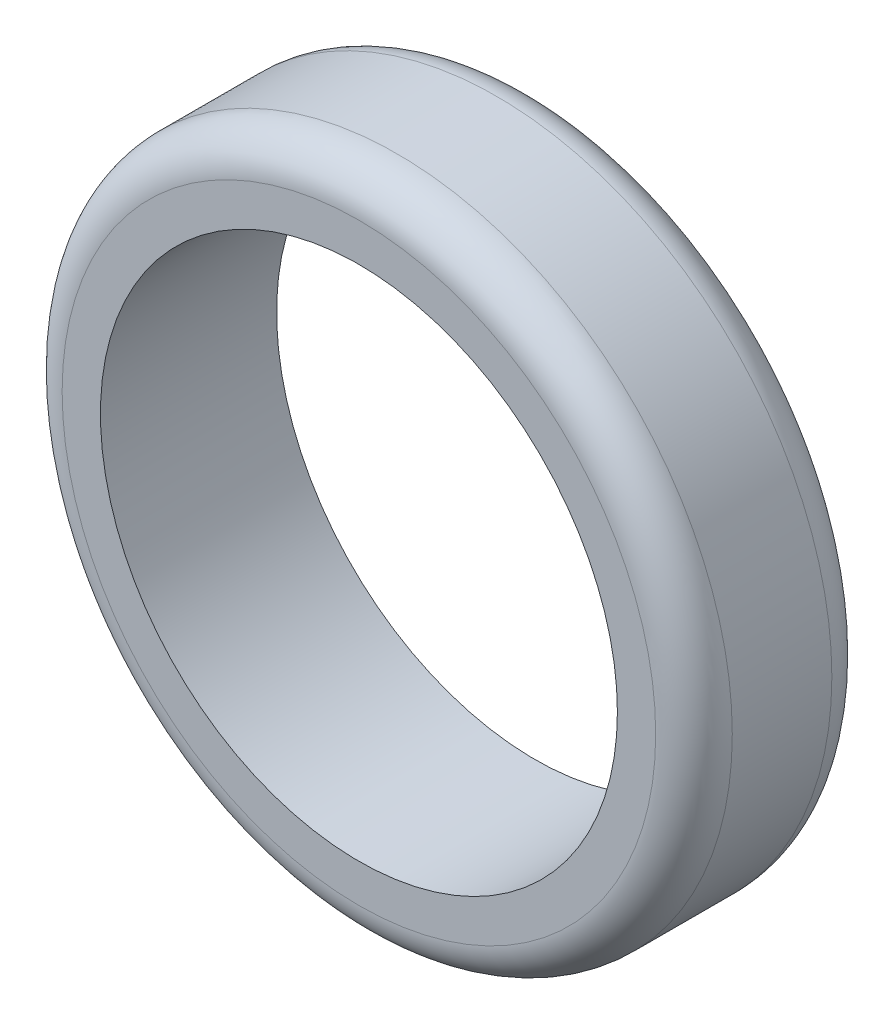
ISO-10303-21;
HEADER;
FILE_DESCRIPTION(('STEP AP214'),'2;1');
FILE_NAME('part.step','',(''),(''),'','','');
FILE_SCHEMA(('AUTOMOTIVE_DESIGN { 1 0 10303 214 1 1 1 1 }'));
ENDSEC;
DATA;
#1=APPLICATION_CONTEXT('core data for automotive mechanical design processes');
#2=APPLICATION_PROTOCOL_DEFINITION('international standard','automotive_design',2000,#1);
#3=PRODUCT_CONTEXT('',#1,'mechanical');
#4=PRODUCT('Part','Part','',(#3));
#5=PRODUCT_RELATED_PRODUCT_CATEGORY('part','',(#4));
#6=PRODUCT_DEFINITION_FORMATION('','',#4);
#7=PRODUCT_DEFINITION_CONTEXT('part definition',#1,'design');
#8=PRODUCT_DEFINITION('design','',#6,#7);
#9=PRODUCT_DEFINITION_SHAPE('','',#8);
#10=(LENGTH_UNIT() NAMED_UNIT(*) SI_UNIT(.MILLI.,.METRE.));
#11=(NAMED_UNIT(*) PLANE_ANGLE_UNIT() SI_UNIT($,.RADIAN.));
#12=(NAMED_UNIT(*) SI_UNIT($,.STERADIAN.) SOLID_ANGLE_UNIT());
#13=UNCERTAINTY_MEASURE_WITH_UNIT(LENGTH_MEASURE(1.E-05),#10,'distance_accuracy_value','');
#14=(GEOMETRIC_REPRESENTATION_CONTEXT(3) GLOBAL_UNCERTAINTY_ASSIGNED_CONTEXT((#13)) GLOBAL_UNIT_ASSIGNED_CONTEXT((#10,
#11,#12)) REPRESENTATION_CONTEXT('',''));
#15=CARTESIAN_POINT('',(0.,0.,0.));
#16=DIRECTION('',(0.,0.,1.));
#17=DIRECTION('',(1.,0.,0.));
#18=AXIS2_PLACEMENT_3D('',#15,#16,#17);
#19=CARTESIAN_POINT('',(0.,0.,293.487373415292));
#20=DIRECTION('',(0.,0.,-1.));
#21=DIRECTION('',(-1.,0.,0.));
#22=AXIS2_PLACEMENT_3D('',#19,#20,#21);
#23=CYLINDRICAL_SURFACE('',#22,87.5);
#24=CARTESIAN_POINT('',(0.,0.,36.));
#25=DIRECTION('',(0.,0.,1.));
#26=DIRECTION('',(1.,0.,0.));
#27=AXIS2_PLACEMENT_3D('',#24,#25,#26);
#28=CIRCLE('',#27,87.5);
#29=CARTESIAN_POINT('',(87.5,0.,36.));
#30=VERTEX_POINT('',#29);
#31=EDGE_CURVE('E44',#30,#30,#28,.F.);
#32=ORIENTED_EDGE('',*,*,#31,.T.);
#33=EDGE_LOOP('',(#32));
#34=FACE_BOUND('',#33,.T.);
#35=CARTESIAN_POINT('',(0.,0.,10.));
#36=DIRECTION('',(0.,0.,1.));
#37=DIRECTION('',(1.,0.,0.));
#38=AXIS2_PLACEMENT_3D('',#35,#36,#37);
#39=CIRCLE('',#38,87.5);
#40=CARTESIAN_POINT('',(87.5,0.,10.));
#41=VERTEX_POINT('',#40);
#42=EDGE_CURVE('E48',#41,#41,#39,.T.);
#43=ORIENTED_EDGE('',*,*,#42,.T.);
#44=EDGE_LOOP('',(#43));
#45=FACE_BOUND('',#44,.T.);
#46=ADVANCED_FACE('F37',(#34,#45),#23,.T.);
#47=CARTESIAN_POINT('',(0.,0.,0.));
#48=DIRECTION('',(0.,0.,1.));
#49=DIRECTION('',(1.,0.,0.));
#50=AXIS2_PLACEMENT_3D('',#47,#48,#49);
#51=PLANE('',#50);
#52=CARTESIAN_POINT('',(0.,0.,0.));
#53=DIRECTION('',(0.,0.,1.));
#54=DIRECTION('',(1.,0.,0.));
#55=AXIS2_PLACEMENT_3D('',#52,#53,#54);
#56=CIRCLE('',#55,77.5);
#57=CARTESIAN_POINT('',(77.5,0.,0.));
#58=VERTEX_POINT('',#57);
#59=EDGE_CURVE('E10',#58,#58,#56,.F.);
#60=ORIENTED_EDGE('',*,*,#59,.T.);
#61=EDGE_LOOP('',(#60));
#62=FACE_BOUND('',#61,.T.);
#63=CARTESIAN_POINT('',(0.,0.,0.));
#64=DIRECTION('',(0.,0.,1.));
#65=DIRECTION('',(1.,0.,0.));
#66=AXIS2_PLACEMENT_3D('',#63,#64,#65);
#67=CIRCLE('',#66,67.5);
#68=CARTESIAN_POINT('',(67.5,0.,0.));
#69=VERTEX_POINT('',#68);
#70=EDGE_CURVE('E57',#69,#69,#67,.T.);
#71=ORIENTED_EDGE('',*,*,#70,.T.);
#72=EDGE_LOOP('',(#71));
#73=FACE_BOUND('',#72,.T.);
#74=ADVANCED_FACE('F64',(#62,#73),#51,.F.);
#75=CARTESIAN_POINT('',(0.,0.,293.487373415292));
#76=DIRECTION('',(0.,0.,-1.));
#77=DIRECTION('',(-1.,0.,0.));
#78=AXIS2_PLACEMENT_3D('',#75,#76,#77);
#79=CYLINDRICAL_SURFACE('',#78,67.5);
#80=ORIENTED_EDGE('',*,*,#70,.F.);
#81=EDGE_LOOP('',(#80));
#82=FACE_BOUND('',#81,.T.);
#83=CARTESIAN_POINT('',(0.,0.,46.));
#84=DIRECTION('',(0.,0.,1.));
#85=DIRECTION('',(1.,0.,0.));
#86=AXIS2_PLACEMENT_3D('',#83,#84,#85);
#87=CIRCLE('',#86,67.5);
#88=CARTESIAN_POINT('',(67.5,0.,46.));
#89=VERTEX_POINT('',#88);
#90=EDGE_CURVE('E58',#89,#89,#87,.T.);
#91=ORIENTED_EDGE('',*,*,#90,.T.);
#92=EDGE_LOOP('',(#91));
#93=FACE_BOUND('',#92,.T.);
#94=ADVANCED_FACE('F66',(#82,#93),#79,.F.);
#95=CARTESIAN_POINT('',(0.,0.,46.));
#96=DIRECTION('',(0.,0.,1.));
#97=DIRECTION('',(1.,0.,0.));
#98=AXIS2_PLACEMENT_3D('',#95,#96,#97);
#99=PLANE('',#98);
#100=CARTESIAN_POINT('',(0.,0.,46.));
#101=DIRECTION('',(0.,0.,1.));
#102=DIRECTION('',(1.,0.,0.));
#103=AXIS2_PLACEMENT_3D('',#100,#101,#102);
#104=CIRCLE('',#103,77.5);
#105=CARTESIAN_POINT('',(77.5,0.,46.));
#106=VERTEX_POINT('',#105);
#107=EDGE_CURVE('E52',#106,#106,#104,.T.);
#108=ORIENTED_EDGE('',*,*,#107,.T.);
#109=EDGE_LOOP('',(#108));
#110=FACE_BOUND('',#109,.T.);
#111=ORIENTED_EDGE('',*,*,#90,.F.);
#112=EDGE_LOOP('',(#111));
#113=FACE_BOUND('',#112,.T.);
#114=ADVANCED_FACE('F69',(#110,#113),#99,.T.);
#115=CARTESIAN_POINT('',(0.,0.,36.));
#116=DIRECTION('',(0.,0.,1.));
#117=DIRECTION('',(1.,0.,0.));
#118=AXIS2_PLACEMENT_3D('',#115,#116,#117);
#119=TOROIDAL_SURFACE('',#118,77.5,10.);
#120=ORIENTED_EDGE('',*,*,#31,.F.);
#121=EDGE_LOOP('',(#120));
#122=FACE_BOUND('',#121,.T.);
#123=ORIENTED_EDGE('',*,*,#107,.F.);
#124=EDGE_LOOP('',(#123));
#125=FACE_BOUND('',#124,.T.);
#126=ADVANCED_FACE('F74',(#122,#125),#119,.T.);
#127=CARTESIAN_POINT('',(0.,0.,10.));
#128=DIRECTION('',(0.,0.,1.));
#129=DIRECTION('',(1.,0.,0.));
#130=AXIS2_PLACEMENT_3D('',#127,#128,#129);
#131=TOROIDAL_SURFACE('',#130,77.5,10.);
#132=ORIENTED_EDGE('',*,*,#59,.F.);
#133=EDGE_LOOP('',(#132));
#134=FACE_BOUND('',#133,.T.);
#135=ORIENTED_EDGE('',*,*,#42,.F.);
#136=EDGE_LOOP('',(#135));
#137=FACE_BOUND('',#136,.T.);
#138=ADVANCED_FACE('F39',(#134,#137),#131,.T.);
#139=CLOSED_SHELL('',(#46,#74,#94,#114,#126,#138));
#140=MANIFOLD_SOLID_BREP('B2',#139);
#141=ADVANCED_BREP_SHAPE_REPRESENTATION('',(#18,#140),#14);
#142=SHAPE_DEFINITION_REPRESENTATION(#9,#141);
ENDSEC;
END-ISO-10303-21;
